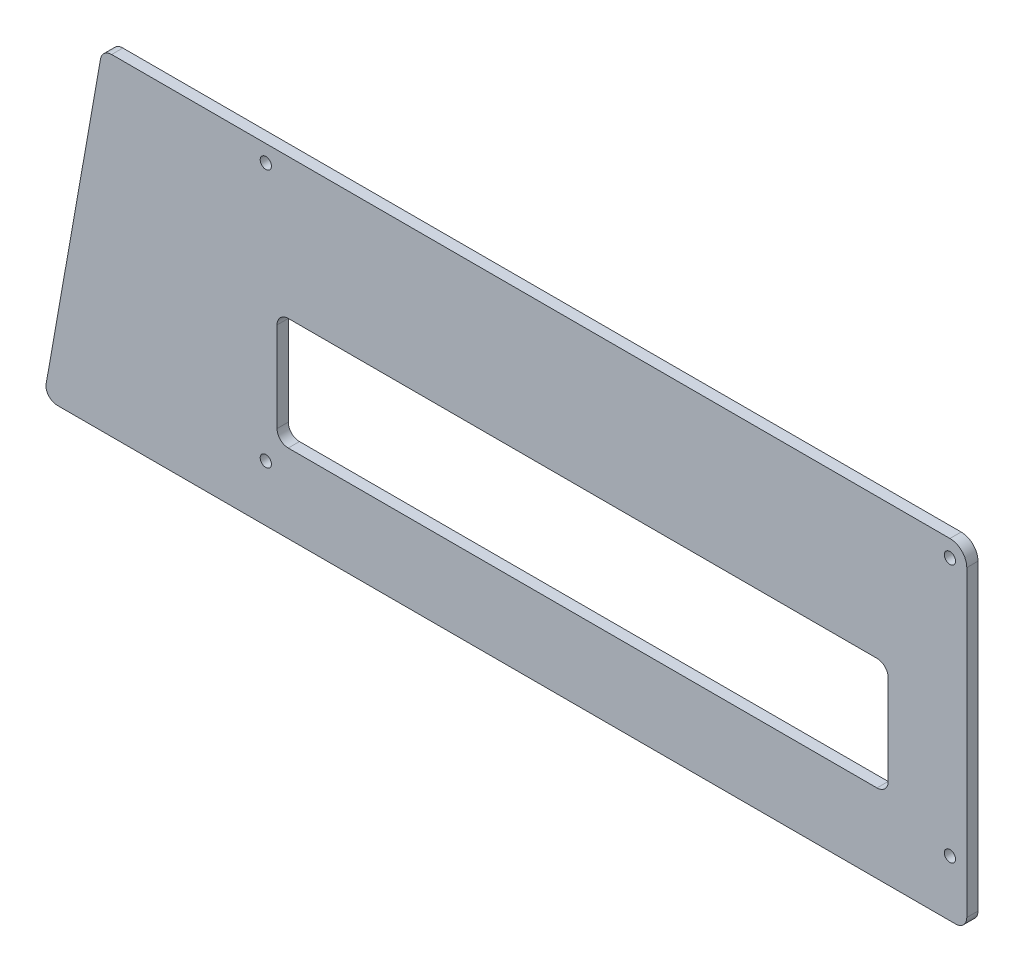
ISO-10303-21;
HEADER;
FILE_DESCRIPTION(('STEP AP214'),'2;1');
FILE_NAME('part.step','',(''),(''),'','','');
FILE_SCHEMA(('AUTOMOTIVE_DESIGN { 1 0 10303 214 1 1 1 1 }'));
ENDSEC;
DATA;
#1=APPLICATION_CONTEXT('core data for automotive mechanical design processes');
#2=APPLICATION_PROTOCOL_DEFINITION('international standard','automotive_design',2000,#1);
#3=PRODUCT_CONTEXT('',#1,'mechanical');
#4=PRODUCT('Part','Part','',(#3));
#5=PRODUCT_RELATED_PRODUCT_CATEGORY('part','',(#4));
#6=PRODUCT_DEFINITION_FORMATION('','',#4);
#7=PRODUCT_DEFINITION_CONTEXT('part definition',#1,'design');
#8=PRODUCT_DEFINITION('design','',#6,#7);
#9=PRODUCT_DEFINITION_SHAPE('','',#8);
#10=(LENGTH_UNIT() NAMED_UNIT(*) SI_UNIT(.MILLI.,.METRE.));
#11=(NAMED_UNIT(*) PLANE_ANGLE_UNIT() SI_UNIT($,.RADIAN.));
#12=(NAMED_UNIT(*) SI_UNIT($,.STERADIAN.) SOLID_ANGLE_UNIT());
#13=UNCERTAINTY_MEASURE_WITH_UNIT(LENGTH_MEASURE(1.E-05),#10,'distance_accuracy_value','');
#14=(GEOMETRIC_REPRESENTATION_CONTEXT(3) GLOBAL_UNCERTAINTY_ASSIGNED_CONTEXT((#13)) GLOBAL_UNIT_ASSIGNED_CONTEXT((#10,
#11,#12)) REPRESENTATION_CONTEXT('',''));
#15=CARTESIAN_POINT('',(0.,0.,0.));
#16=DIRECTION('',(0.,0.,1.));
#17=DIRECTION('',(1.,0.,0.));
#18=AXIS2_PLACEMENT_3D('',#15,#16,#17);
#19=CARTESIAN_POINT('',(58.1647011961699,256.380138422723,10.));
#20=DIRECTION('',(0.,0.,-1.));
#21=DIRECTION('',(-1.,0.,0.));
#22=AXIS2_PLACEMENT_3D('',#19,#20,#21);
#23=PLANE('',#22);
#24=CARTESIAN_POINT('',(58.1647011961699,26.3801384227226,10.));
#25=DIRECTION('',(0.,0.,1.));
#26=DIRECTION('',(-1.,0.,0.));
#27=AXIS2_PLACEMENT_3D('',#24,#25,#26);
#28=CIRCLE('',#27,5.00000000000004);
#29=CARTESIAN_POINT('',(53.1647011961699,26.3801384227226,10.));
#30=VERTEX_POINT('',#29);
#31=EDGE_CURVE('E210',#30,#30,#28,.T.);
#32=ORIENTED_EDGE('',*,*,#31,.F.);
#33=EDGE_LOOP('',(#32));
#34=FACE_BOUND('',#33,.T.);
#35=CARTESIAN_POINT('',(-551.43529880383,256.380138422723,10.));
#36=DIRECTION('',(0.,0.,1.));
#37=DIRECTION('',(1.,0.,0.));
#38=AXIS2_PLACEMENT_3D('',#35,#36,#37);
#39=CIRCLE('',#38,5.00000000000005);
#40=CARTESIAN_POINT('',(-546.43529880383,256.380138422723,10.));
#41=VERTEX_POINT('',#40);
#42=EDGE_CURVE('E222',#41,#41,#39,.T.);
#43=ORIENTED_EDGE('',*,*,#42,.F.);
#44=EDGE_LOOP('',(#43));
#45=FACE_BOUND('',#44,.T.);
#46=CARTESIAN_POINT('',(58.1647011961699,256.380138422723,10.));
#47=DIRECTION('',(0.,0.,1.));
#48=DIRECTION('',(-1.,0.,0.));
#49=AXIS2_PLACEMENT_3D('',#46,#47,#48);
#50=CIRCLE('',#49,15.0000000000001);
#51=CARTESIAN_POINT('',(73.16470119617,256.380138422723,10.));
#52=VERTEX_POINT('',#51);
#53=CARTESIAN_POINT('',(58.1647011961699,271.380138422723,10.));
#54=VERTEX_POINT('',#53);
#55=EDGE_CURVE('E234',#52,#54,#50,.T.);
#56=ORIENTED_EDGE('',*,*,#55,.T.);
#57=DIRECTION('',(-1.,0.,0.));
#58=VECTOR('',#57,1.);
#59=CARTESIAN_POINT('',(58.1647011961699,271.380138422723,10.));
#60=LINE('',#59,#58);
#61=CARTESIAN_POINT('',(-688.827843183062,271.380138422723,10.));
#62=VERTEX_POINT('',#61);
#63=EDGE_CURVE('E237',#54,#62,#60,.T.);
#64=ORIENTED_EDGE('',*,*,#63,.T.);
#65=CARTESIAN_POINT('',(-688.827843183062,261.380138422723,10.));
#66=DIRECTION('',(0.,0.,1.));
#67=DIRECTION('',(1.,0.,0.));
#68=AXIS2_PLACEMENT_3D('',#65,#66,#67);
#69=CIRCLE('',#68,9.99999999999999);
#70=CARTESIAN_POINT('',(-698.675920713184,263.116620199392,10.));
#71=VERTEX_POINT('',#70);
#72=EDGE_CURVE('E240',#62,#71,#69,.T.);
#73=ORIENTED_EDGE('',*,*,#72,.T.);
#74=DIRECTION('',(-0.173648177666925,-0.984807753012209,0.));
#75=VECTOR('',#74,1.);
#76=CARTESIAN_POINT('',(-747.16584040801,-11.8833798006081,10.));
#77=LINE('',#76,#75);
#78=CARTESIAN_POINT('',(-747.16584040801,-11.8833798006081,10.));
#79=VERTEX_POINT('',#78);
#80=EDGE_CURVE('E242',#71,#79,#77,.T.);
#81=ORIENTED_EDGE('',*,*,#80,.T.);
#82=CARTESIAN_POINT('',(-737.317762877888,-13.6198615772775,10.));
#83=DIRECTION('',(0.,0.,1.));
#84=DIRECTION('',(-1.,0.,0.));
#85=AXIS2_PLACEMENT_3D('',#82,#83,#84);
#86=CIRCLE('',#85,10.);
#87=CARTESIAN_POINT('',(-737.317762877888,-23.6198615772775,10.));
#88=VERTEX_POINT('',#87);
#89=EDGE_CURVE('E244',#79,#88,#86,.T.);
#90=ORIENTED_EDGE('',*,*,#89,.T.);
#91=DIRECTION('',(1.,0.,0.));
#92=VECTOR('',#91,1.);
#93=CARTESIAN_POINT('',(-737.317762877888,-23.6198615772775,10.));
#94=LINE('',#93,#92);
#95=CARTESIAN_POINT('',(63.1647011961699,-23.6198615772775,10.));
#96=VERTEX_POINT('',#95);
#97=EDGE_CURVE('E246',#88,#96,#94,.T.);
#98=ORIENTED_EDGE('',*,*,#97,.T.);
#99=CARTESIAN_POINT('',(63.1647011961699,-13.6198615772775,10.));
#100=DIRECTION('',(0.,0.,1.));
#101=DIRECTION('',(1.,0.,0.));
#102=AXIS2_PLACEMENT_3D('',#99,#100,#101);
#103=CIRCLE('',#102,10.);
#104=CARTESIAN_POINT('',(73.1647011961699,-13.6198615772774,10.));
#105=VERTEX_POINT('',#104);
#106=EDGE_CURVE('E248',#96,#105,#103,.T.);
#107=ORIENTED_EDGE('',*,*,#106,.T.);
#108=DIRECTION('',(0.,1.,0.));
#109=VECTOR('',#108,1.);
#110=CARTESIAN_POINT('',(73.16470119617,256.380138422723,10.));
#111=LINE('',#110,#109);
#112=EDGE_CURVE('E250',#105,#52,#111,.T.);
#113=ORIENTED_EDGE('',*,*,#112,.T.);
#114=EDGE_LOOP('',(#56,#64,#73,#81,#90,#98,#107,#113));
#115=FACE_BOUND('',#114,.T.);
#116=CARTESIAN_POINT('',(-551.43529880383,26.3801384227226,10.));
#117=DIRECTION('',(0.,0.,1.));
#118=DIRECTION('',(1.,0.,0.));
#119=AXIS2_PLACEMENT_3D('',#116,#117,#118);
#120=CIRCLE('',#119,5.00000000000004);
#121=CARTESIAN_POINT('',(-546.43529880383,26.3801384227226,10.));
#122=VERTEX_POINT('',#121);
#123=EDGE_CURVE('E228',#122,#122,#120,.T.);
#124=ORIENTED_EDGE('',*,*,#123,.F.);
#125=EDGE_LOOP('',(#124));
#126=FACE_BOUND('',#125,.T.);
#127=CARTESIAN_POINT('',(58.1647011961699,256.380138422723,10.));
#128=DIRECTION('',(0.,0.,1.));
#129=DIRECTION('',(-1.,0.,0.));
#130=AXIS2_PLACEMENT_3D('',#127,#128,#129);
#131=CIRCLE('',#130,5.00000000000005);
#132=CARTESIAN_POINT('',(53.1647011961699,256.380138422723,10.));
#133=VERTEX_POINT('',#132);
#134=EDGE_CURVE('E216',#133,#133,#131,.T.);
#135=ORIENTED_EDGE('',*,*,#134,.F.);
#136=EDGE_LOOP('',(#135));
#137=FACE_BOUND('',#136,.T.);
#138=CARTESIAN_POINT('',(-531.43529880383,56.3801384227226,10.));
#139=DIRECTION('',(0.,0.,1.));
#140=DIRECTION('',(1.,0.,0.));
#141=AXIS2_PLACEMENT_3D('',#138,#139,#140);
#142=CIRCLE('',#141,10.);
#143=CARTESIAN_POINT('',(-541.43529880383,56.3801384227226,10.));
#144=VERTEX_POINT('',#143);
#145=CARTESIAN_POINT('',(-531.43529880383,46.3801384227226,10.));
#146=VERTEX_POINT('',#145);
#147=EDGE_CURVE('E145',#144,#146,#142,.T.);
#148=ORIENTED_EDGE('',*,*,#147,.F.);
#149=DIRECTION('',(0.,-1.,0.));
#150=VECTOR('',#149,1.);
#151=CARTESIAN_POINT('',(-541.43529880383,56.3801384227226,10.));
#152=LINE('',#151,#150);
#153=CARTESIAN_POINT('',(-541.43529880383,136.380138422722,10.));
#154=VERTEX_POINT('',#153);
#155=EDGE_CURVE('E178',#154,#144,#152,.T.);
#156=ORIENTED_EDGE('',*,*,#155,.F.);
#157=CARTESIAN_POINT('',(-531.43529880383,136.380138422723,10.));
#158=DIRECTION('',(0.,0.,1.));
#159=DIRECTION('',(1.,0.,0.));
#160=AXIS2_PLACEMENT_3D('',#157,#158,#159);
#161=CIRCLE('',#160,10.);
#162=CARTESIAN_POINT('',(-531.43529880383,146.380138422723,10.));
#163=VERTEX_POINT('',#162);
#164=EDGE_CURVE('E176',#163,#154,#161,.T.);
#165=ORIENTED_EDGE('',*,*,#164,.F.);
#166=DIRECTION('',(-1.,0.,0.));
#167=VECTOR('',#166,1.);
#168=CARTESIAN_POINT('',(-531.43529880383,146.380138422723,10.));
#169=LINE('',#168,#167);
#170=CARTESIAN_POINT('',(-6.83529880383011,146.380138422723,10.));
#171=VERTEX_POINT('',#170);
#172=EDGE_CURVE('E174',#171,#163,#169,.T.);
#173=ORIENTED_EDGE('',*,*,#172,.F.);
#174=CARTESIAN_POINT('',(-6.83529880383004,136.380138422723,10.));
#175=DIRECTION('',(0.,0.,1.));
#176=DIRECTION('',(1.,0.,0.));
#177=AXIS2_PLACEMENT_3D('',#174,#175,#176);
#178=CIRCLE('',#177,10.);
#179=CARTESIAN_POINT('',(3.16470119616996,136.380138422722,10.));
#180=VERTEX_POINT('',#179);
#181=EDGE_CURVE('E172',#180,#171,#178,.T.);
#182=ORIENTED_EDGE('',*,*,#181,.F.);
#183=DIRECTION('',(0.,1.,0.));
#184=VECTOR('',#183,1.);
#185=CARTESIAN_POINT('',(3.16470119616996,136.380138422722,10.));
#186=LINE('',#185,#184);
#187=CARTESIAN_POINT('',(3.16470119616996,56.3801384227226,10.));
#188=VERTEX_POINT('',#187);
#189=EDGE_CURVE('E168',#188,#180,#186,.T.);
#190=ORIENTED_EDGE('',*,*,#189,.F.);
#191=CARTESIAN_POINT('',(-6.83529880383004,56.3801384227225,10.));
#192=DIRECTION('',(0.,0.,1.));
#193=DIRECTION('',(1.,0.,0.));
#194=AXIS2_PLACEMENT_3D('',#191,#192,#193);
#195=CIRCLE('',#194,10.);
#196=CARTESIAN_POINT('',(-6.83529880383011,46.3801384227225,10.));
#197=VERTEX_POINT('',#196);
#198=EDGE_CURVE('E166',#197,#188,#195,.T.);
#199=ORIENTED_EDGE('',*,*,#198,.F.);
#200=DIRECTION('',(1.,0.,0.));
#201=VECTOR('',#200,1.);
#202=CARTESIAN_POINT('',(-531.43529880383,46.3801384227226,10.));
#203=LINE('',#202,#201);
#204=EDGE_CURVE('E153',#146,#197,#203,.T.);
#205=ORIENTED_EDGE('',*,*,#204,.F.);
#206=EDGE_LOOP('',(#148,#156,#165,#173,#182,#190,#199,#205));
#207=FACE_BOUND('',#206,.T.);
#208=ADVANCED_FACE('F32',(#34,#45,#115,#126,#137,#207),#23,.F.);
#209=CARTESIAN_POINT('',(58.1647011961699,256.380138422723,0.));
#210=DIRECTION('',(0.,0.,-1.));
#211=DIRECTION('',(-1.,0.,0.));
#212=AXIS2_PLACEMENT_3D('',#209,#210,#211);
#213=PLANE('',#212);
#214=CARTESIAN_POINT('',(58.1647011961699,26.3801384227226,0.));
#215=DIRECTION('',(0.,0.,1.));
#216=DIRECTION('',(-1.,0.,0.));
#217=AXIS2_PLACEMENT_3D('',#214,#215,#216);
#218=CIRCLE('',#217,5.00000000000004);
#219=CARTESIAN_POINT('',(53.1647011961699,26.3801384227226,0.));
#220=VERTEX_POINT('',#219);
#221=EDGE_CURVE('E161',#220,#220,#218,.T.);
#222=ORIENTED_EDGE('',*,*,#221,.T.);
#223=EDGE_LOOP('',(#222));
#224=FACE_BOUND('',#223,.T.);
#225=CARTESIAN_POINT('',(-551.43529880383,256.380138422723,0.));
#226=DIRECTION('',(0.,0.,1.));
#227=DIRECTION('',(1.,0.,0.));
#228=AXIS2_PLACEMENT_3D('',#225,#226,#227);
#229=CIRCLE('',#228,5.00000000000005);
#230=CARTESIAN_POINT('',(-546.43529880383,256.380138422723,0.));
#231=VERTEX_POINT('',#230);
#232=EDGE_CURVE('E219',#231,#231,#229,.T.);
#233=ORIENTED_EDGE('',*,*,#232,.T.);
#234=EDGE_LOOP('',(#233));
#235=FACE_BOUND('',#234,.T.);
#236=CARTESIAN_POINT('',(58.1647011961699,256.380138422723,0.));
#237=DIRECTION('',(0.,0.,1.));
#238=DIRECTION('',(-1.,0.,0.));
#239=AXIS2_PLACEMENT_3D('',#236,#237,#238);
#240=CIRCLE('',#239,15.0000000000001);
#241=CARTESIAN_POINT('',(73.16470119617,256.380138422723,0.));
#242=VERTEX_POINT('',#241);
#243=CARTESIAN_POINT('',(58.1647011961699,271.380138422723,0.));
#244=VERTEX_POINT('',#243);
#245=EDGE_CURVE('E231',#242,#244,#240,.T.);
#246=ORIENTED_EDGE('',*,*,#245,.F.);
#247=DIRECTION('',(0.,1.,0.));
#248=VECTOR('',#247,1.);
#249=CARTESIAN_POINT('',(73.16470119617,256.380138422723,0.));
#250=LINE('',#249,#248);
#251=CARTESIAN_POINT('',(73.1647011961699,-13.6198615772774,0.));
#252=VERTEX_POINT('',#251);
#253=EDGE_CURVE('E238',#252,#242,#250,.T.);
#254=ORIENTED_EDGE('',*,*,#253,.F.);
#255=CARTESIAN_POINT('',(63.1647011961699,-13.6198615772775,0.));
#256=DIRECTION('',(0.,0.,1.));
#257=DIRECTION('',(1.,0.,0.));
#258=AXIS2_PLACEMENT_3D('',#255,#256,#257);
#259=CIRCLE('',#258,10.);
#260=CARTESIAN_POINT('',(63.1647011961699,-23.6198615772775,0.));
#261=VERTEX_POINT('',#260);
#262=EDGE_CURVE('E265',#261,#252,#259,.T.);
#263=ORIENTED_EDGE('',*,*,#262,.F.);
#264=DIRECTION('',(1.,0.,0.));
#265=VECTOR('',#264,1.);
#266=CARTESIAN_POINT('',(-737.317762877888,-23.6198615772775,0.));
#267=LINE('',#266,#265);
#268=CARTESIAN_POINT('',(-737.317762877888,-23.6198615772775,0.));
#269=VERTEX_POINT('',#268);
#270=EDGE_CURVE('E263',#269,#261,#267,.T.);
#271=ORIENTED_EDGE('',*,*,#270,.F.);
#272=CARTESIAN_POINT('',(-737.317762877888,-13.6198615772775,0.));
#273=DIRECTION('',(0.,0.,1.));
#274=DIRECTION('',(-1.,0.,0.));
#275=AXIS2_PLACEMENT_3D('',#272,#273,#274);
#276=CIRCLE('',#275,10.);
#277=CARTESIAN_POINT('',(-747.16584040801,-11.8833798006081,0.));
#278=VERTEX_POINT('',#277);
#279=EDGE_CURVE('E261',#278,#269,#276,.T.);
#280=ORIENTED_EDGE('',*,*,#279,.F.);
#281=DIRECTION('',(-0.173648177666925,-0.984807753012209,0.));
#282=VECTOR('',#281,1.);
#283=CARTESIAN_POINT('',(-747.16584040801,-11.8833798006081,0.));
#284=LINE('',#283,#282);
#285=CARTESIAN_POINT('',(-698.675920713184,263.116620199392,0.));
#286=VERTEX_POINT('',#285);
#287=EDGE_CURVE('E259',#286,#278,#284,.T.);
#288=ORIENTED_EDGE('',*,*,#287,.F.);
#289=CARTESIAN_POINT('',(-688.827843183062,261.380138422723,0.));
#290=DIRECTION('',(0.,0.,1.));
#291=DIRECTION('',(1.,0.,0.));
#292=AXIS2_PLACEMENT_3D('',#289,#290,#291);
#293=CIRCLE('',#292,9.99999999999999);
#294=CARTESIAN_POINT('',(-688.827843183062,271.380138422723,0.));
#295=VERTEX_POINT('',#294);
#296=EDGE_CURVE('E257',#295,#286,#293,.T.);
#297=ORIENTED_EDGE('',*,*,#296,.F.);
#298=DIRECTION('',(-1.,0.,0.));
#299=VECTOR('',#298,1.);
#300=CARTESIAN_POINT('',(58.1647011961699,271.380138422723,0.));
#301=LINE('',#300,#299);
#302=EDGE_CURVE('E255',#244,#295,#301,.T.);
#303=ORIENTED_EDGE('',*,*,#302,.F.);
#304=EDGE_LOOP('',(#246,#254,#263,#271,#280,#288,#297,#303));
#305=FACE_BOUND('',#304,.T.);
#306=CARTESIAN_POINT('',(-551.43529880383,26.3801384227226,0.));
#307=DIRECTION('',(0.,0.,1.));
#308=DIRECTION('',(1.,0.,0.));
#309=AXIS2_PLACEMENT_3D('',#306,#307,#308);
#310=CIRCLE('',#309,5.00000000000004);
#311=CARTESIAN_POINT('',(-546.43529880383,26.3801384227226,0.));
#312=VERTEX_POINT('',#311);
#313=EDGE_CURVE('E225',#312,#312,#310,.T.);
#314=ORIENTED_EDGE('',*,*,#313,.T.);
#315=EDGE_LOOP('',(#314));
#316=FACE_BOUND('',#315,.T.);
#317=CARTESIAN_POINT('',(58.1647011961699,256.380138422723,0.));
#318=DIRECTION('',(0.,0.,1.));
#319=DIRECTION('',(-1.,0.,0.));
#320=AXIS2_PLACEMENT_3D('',#317,#318,#319);
#321=CIRCLE('',#320,5.00000000000005);
#322=CARTESIAN_POINT('',(53.1647011961699,256.380138422723,0.));
#323=VERTEX_POINT('',#322);
#324=EDGE_CURVE('E213',#323,#323,#321,.T.);
#325=ORIENTED_EDGE('',*,*,#324,.T.);
#326=EDGE_LOOP('',(#325));
#327=FACE_BOUND('',#326,.T.);
#328=DIRECTION('',(0.,-1.,0.));
#329=VECTOR('',#328,1.);
#330=CARTESIAN_POINT('',(-541.43529880383,56.3801384227226,0.));
#331=LINE('',#330,#329);
#332=CARTESIAN_POINT('',(-541.43529880383,136.380138422722,0.));
#333=VERTEX_POINT('',#332);
#334=CARTESIAN_POINT('',(-541.43529880383,56.3801384227226,0.));
#335=VERTEX_POINT('',#334);
#336=EDGE_CURVE('E154',#333,#335,#331,.T.);
#337=ORIENTED_EDGE('',*,*,#336,.T.);
#338=CARTESIAN_POINT('',(-531.43529880383,56.3801384227226,0.));
#339=DIRECTION('',(0.,0.,1.));
#340=DIRECTION('',(1.,0.,0.));
#341=AXIS2_PLACEMENT_3D('',#338,#339,#340);
#342=CIRCLE('',#341,10.);
#343=CARTESIAN_POINT('',(-531.43529880383,46.3801384227226,0.));
#344=VERTEX_POINT('',#343);
#345=EDGE_CURVE('E55',#335,#344,#342,.T.);
#346=ORIENTED_EDGE('',*,*,#345,.T.);
#347=DIRECTION('',(1.,0.,0.));
#348=VECTOR('',#347,1.);
#349=CARTESIAN_POINT('',(-531.43529880383,46.3801384227226,0.));
#350=LINE('',#349,#348);
#351=CARTESIAN_POINT('',(-6.83529880383011,46.3801384227225,0.));
#352=VERTEX_POINT('',#351);
#353=EDGE_CURVE('E160',#344,#352,#350,.T.);
#354=ORIENTED_EDGE('',*,*,#353,.T.);
#355=CARTESIAN_POINT('',(-6.83529880383004,56.3801384227225,0.));
#356=DIRECTION('',(0.,0.,1.));
#357=DIRECTION('',(1.,0.,0.));
#358=AXIS2_PLACEMENT_3D('',#355,#356,#357);
#359=CIRCLE('',#358,10.);
#360=CARTESIAN_POINT('',(3.16470119616996,56.3801384227226,0.));
#361=VERTEX_POINT('',#360);
#362=EDGE_CURVE('E182',#352,#361,#359,.T.);
#363=ORIENTED_EDGE('',*,*,#362,.T.);
#364=DIRECTION('',(0.,1.,0.));
#365=VECTOR('',#364,1.);
#366=CARTESIAN_POINT('',(3.16470119616996,136.380138422722,0.));
#367=LINE('',#366,#365);
#368=CARTESIAN_POINT('',(3.16470119616996,136.380138422722,0.));
#369=VERTEX_POINT('',#368);
#370=EDGE_CURVE('E185',#361,#369,#367,.T.);
#371=ORIENTED_EDGE('',*,*,#370,.T.);
#372=CARTESIAN_POINT('',(-6.83529880383004,136.380138422723,0.));
#373=DIRECTION('',(0.,0.,1.));
#374=DIRECTION('',(1.,0.,0.));
#375=AXIS2_PLACEMENT_3D('',#372,#373,#374);
#376=CIRCLE('',#375,10.);
#377=CARTESIAN_POINT('',(-6.83529880383011,146.380138422723,0.));
#378=VERTEX_POINT('',#377);
#379=EDGE_CURVE('E188',#369,#378,#376,.T.);
#380=ORIENTED_EDGE('',*,*,#379,.T.);
#381=DIRECTION('',(-1.,0.,0.));
#382=VECTOR('',#381,1.);
#383=CARTESIAN_POINT('',(-531.43529880383,146.380138422723,0.));
#384=LINE('',#383,#382);
#385=CARTESIAN_POINT('',(-531.43529880383,146.380138422723,0.));
#386=VERTEX_POINT('',#385);
#387=EDGE_CURVE('E191',#378,#386,#384,.T.);
#388=ORIENTED_EDGE('',*,*,#387,.T.);
#389=CARTESIAN_POINT('',(-531.43529880383,136.380138422723,0.));
#390=DIRECTION('',(0.,0.,1.));
#391=DIRECTION('',(1.,0.,0.));
#392=AXIS2_PLACEMENT_3D('',#389,#390,#391);
#393=CIRCLE('',#392,10.);
#394=EDGE_CURVE('E194',#386,#333,#393,.T.);
#395=ORIENTED_EDGE('',*,*,#394,.T.);
#396=EDGE_LOOP('',(#337,#346,#354,#363,#371,#380,#388,#395));
#397=FACE_BOUND('',#396,.T.);
#398=ADVANCED_FACE('F295',(#224,#235,#305,#316,#327,#397),#213,.T.);
#399=CARTESIAN_POINT('',(58.1647011961699,256.380138422723,10.));
#400=DIRECTION('',(0.,0.,-1.));
#401=DIRECTION('',(-1.,0.,0.));
#402=AXIS2_PLACEMENT_3D('',#399,#400,#401);
#403=CYLINDRICAL_SURFACE('',#402,15.0000000000001);
#404=ORIENTED_EDGE('',*,*,#245,.T.);
#405=DIRECTION('',(0.,0.,-1.));
#406=VECTOR('',#405,1.);
#407=CARTESIAN_POINT('',(58.1647011961699,271.380138422723,10.));
#408=LINE('',#407,#406);
#409=EDGE_CURVE('E11',#54,#244,#408,.T.);
#410=ORIENTED_EDGE('',*,*,#409,.F.);
#411=ORIENTED_EDGE('',*,*,#55,.F.);
#412=DIRECTION('',(0.,0.,-1.));
#413=VECTOR('',#412,1.);
#414=CARTESIAN_POINT('',(73.16470119617,256.380138422723,10.));
#415=LINE('',#414,#413);
#416=EDGE_CURVE('E252',#52,#242,#415,.T.);
#417=ORIENTED_EDGE('',*,*,#416,.T.);
#418=EDGE_LOOP('',(#404,#410,#411,#417));
#419=FACE_BOUND('',#418,.T.);
#420=ADVANCED_FACE('F34',(#419),#403,.T.);
#421=CARTESIAN_POINT('',(58.1647011961699,271.380138422723,10.));
#422=DIRECTION('',(0.,-1.,0.));
#423=DIRECTION('',(1.,0.,0.));
#424=AXIS2_PLACEMENT_3D('',#421,#422,#423);
#425=PLANE('',#424);
#426=ORIENTED_EDGE('',*,*,#302,.T.);
#427=DIRECTION('',(0.,0.,-1.));
#428=VECTOR('',#427,1.);
#429=CARTESIAN_POINT('',(-688.827843183062,271.380138422723,10.));
#430=LINE('',#429,#428);
#431=EDGE_CURVE('E40',#62,#295,#430,.T.);
#432=ORIENTED_EDGE('',*,*,#431,.F.);
#433=ORIENTED_EDGE('',*,*,#63,.F.);
#434=ORIENTED_EDGE('',*,*,#409,.T.);
#435=EDGE_LOOP('',(#426,#432,#433,#434));
#436=FACE_BOUND('',#435,.T.);
#437=ADVANCED_FACE('F313',(#436),#425,.F.);
#438=CARTESIAN_POINT('',(-688.827843183062,261.380138422723,10.));
#439=DIRECTION('',(0.,0.,-1.));
#440=DIRECTION('',(-1.,0.,0.));
#441=AXIS2_PLACEMENT_3D('',#438,#439,#440);
#442=CYLINDRICAL_SURFACE('',#441,9.99999999999999);
#443=ORIENTED_EDGE('',*,*,#296,.T.);
#444=DIRECTION('',(0.,0.,-1.));
#445=VECTOR('',#444,1.);
#446=CARTESIAN_POINT('',(-698.675920713184,263.116620199392,10.));
#447=LINE('',#446,#445);
#448=EDGE_CURVE('E282',#71,#286,#447,.T.);
#449=ORIENTED_EDGE('',*,*,#448,.F.);
#450=ORIENTED_EDGE('',*,*,#72,.F.);
#451=ORIENTED_EDGE('',*,*,#431,.T.);
#452=EDGE_LOOP('',(#443,#449,#450,#451));
#453=FACE_BOUND('',#452,.T.);
#454=ADVANCED_FACE('F289',(#453),#442,.T.);
#455=CARTESIAN_POINT('',(-747.16584040801,-11.8833798006081,10.));
#456=DIRECTION('',(0.984807753012209,-0.173648177666925,0.));
#457=DIRECTION('',(0.173648177666925,0.984807753012209,0.));
#458=AXIS2_PLACEMENT_3D('',#455,#456,#457);
#459=PLANE('',#458);
#460=ORIENTED_EDGE('',*,*,#287,.T.);
#461=DIRECTION('',(0.,0.,-1.));
#462=VECTOR('',#461,1.);
#463=CARTESIAN_POINT('',(-747.16584040801,-11.8833798006081,10.));
#464=LINE('',#463,#462);
#465=EDGE_CURVE('E279',#79,#278,#464,.T.);
#466=ORIENTED_EDGE('',*,*,#465,.F.);
#467=ORIENTED_EDGE('',*,*,#80,.F.);
#468=ORIENTED_EDGE('',*,*,#448,.T.);
#469=EDGE_LOOP('',(#460,#466,#467,#468));
#470=FACE_BOUND('',#469,.T.);
#471=ADVANCED_FACE('F301',(#470),#459,.F.);
#472=CARTESIAN_POINT('',(-737.317762877888,-13.6198615772775,10.));
#473=DIRECTION('',(0.,0.,-1.));
#474=DIRECTION('',(-1.,0.,0.));
#475=AXIS2_PLACEMENT_3D('',#472,#473,#474);
#476=CYLINDRICAL_SURFACE('',#475,10.);
#477=ORIENTED_EDGE('',*,*,#279,.T.);
#478=DIRECTION('',(0.,0.,-1.));
#479=VECTOR('',#478,1.);
#480=CARTESIAN_POINT('',(-737.317762877888,-23.6198615772775,10.));
#481=LINE('',#480,#479);
#482=EDGE_CURVE('E276',#88,#269,#481,.T.);
#483=ORIENTED_EDGE('',*,*,#482,.F.);
#484=ORIENTED_EDGE('',*,*,#89,.F.);
#485=ORIENTED_EDGE('',*,*,#465,.T.);
#486=EDGE_LOOP('',(#477,#483,#484,#485));
#487=FACE_BOUND('',#486,.T.);
#488=ADVANCED_FACE('F305',(#487),#476,.T.);
#489=CARTESIAN_POINT('',(-737.317762877888,-23.6198615772775,10.));
#490=DIRECTION('',(0.,1.,0.));
#491=DIRECTION('',(-1.,0.,0.));
#492=AXIS2_PLACEMENT_3D('',#489,#490,#491);
#493=PLANE('',#492);
#494=ORIENTED_EDGE('',*,*,#270,.T.);
#495=DIRECTION('',(0.,0.,-1.));
#496=VECTOR('',#495,1.);
#497=CARTESIAN_POINT('',(63.1647011961699,-23.6198615772775,10.));
#498=LINE('',#497,#496);
#499=EDGE_CURVE('E273',#96,#261,#498,.T.);
#500=ORIENTED_EDGE('',*,*,#499,.F.);
#501=ORIENTED_EDGE('',*,*,#97,.F.);
#502=ORIENTED_EDGE('',*,*,#482,.T.);
#503=EDGE_LOOP('',(#494,#500,#501,#502));
#504=FACE_BOUND('',#503,.T.);
#505=ADVANCED_FACE('F326',(#504),#493,.F.);
#506=CARTESIAN_POINT('',(63.1647011961699,-13.6198615772775,10.));
#507=DIRECTION('',(0.,0.,-1.));
#508=DIRECTION('',(-1.,0.,0.));
#509=AXIS2_PLACEMENT_3D('',#506,#507,#508);
#510=CYLINDRICAL_SURFACE('',#509,10.);
#511=ORIENTED_EDGE('',*,*,#262,.T.);
#512=DIRECTION('',(0.,0.,-1.));
#513=VECTOR('',#512,1.);
#514=CARTESIAN_POINT('',(73.1647011961699,-13.6198615772774,10.));
#515=LINE('',#514,#513);
#516=EDGE_CURVE('E270',#105,#252,#515,.T.);
#517=ORIENTED_EDGE('',*,*,#516,.F.);
#518=ORIENTED_EDGE('',*,*,#106,.F.);
#519=ORIENTED_EDGE('',*,*,#499,.T.);
#520=EDGE_LOOP('',(#511,#517,#518,#519));
#521=FACE_BOUND('',#520,.T.);
#522=ADVANCED_FACE('F324',(#521),#510,.T.);
#523=CARTESIAN_POINT('',(73.16470119617,256.380138422723,10.));
#524=DIRECTION('',(-1.,0.,0.));
#525=DIRECTION('',(0.,-1.,0.));
#526=AXIS2_PLACEMENT_3D('',#523,#524,#525);
#527=PLANE('',#526);
#528=ORIENTED_EDGE('',*,*,#253,.T.);
#529=ORIENTED_EDGE('',*,*,#416,.F.);
#530=ORIENTED_EDGE('',*,*,#112,.F.);
#531=ORIENTED_EDGE('',*,*,#516,.T.);
#532=EDGE_LOOP('',(#528,#529,#530,#531));
#533=FACE_BOUND('',#532,.T.);
#534=ADVANCED_FACE('F319',(#533),#527,.F.);
#535=CARTESIAN_POINT('',(-551.43529880383,26.3801384227226,10.));
#536=DIRECTION('',(0.,0.,-1.));
#537=DIRECTION('',(-1.,0.,0.));
#538=AXIS2_PLACEMENT_3D('',#535,#536,#537);
#539=CYLINDRICAL_SURFACE('',#538,5.00000000000004);
#540=ORIENTED_EDGE('',*,*,#123,.T.);
#541=EDGE_LOOP('',(#540));
#542=FACE_BOUND('',#541,.T.);
#543=ORIENTED_EDGE('',*,*,#313,.F.);
#544=EDGE_LOOP('',(#543));
#545=FACE_BOUND('',#544,.T.);
#546=ADVANCED_FACE('F346',(#542,#545),#539,.F.);
#547=CARTESIAN_POINT('',(-551.43529880383,256.380138422723,10.));
#548=DIRECTION('',(0.,0.,-1.));
#549=DIRECTION('',(-1.,0.,0.));
#550=AXIS2_PLACEMENT_3D('',#547,#548,#549);
#551=CYLINDRICAL_SURFACE('',#550,5.00000000000005);
#552=ORIENTED_EDGE('',*,*,#42,.T.);
#553=EDGE_LOOP('',(#552));
#554=FACE_BOUND('',#553,.T.);
#555=ORIENTED_EDGE('',*,*,#232,.F.);
#556=EDGE_LOOP('',(#555));
#557=FACE_BOUND('',#556,.T.);
#558=ADVANCED_FACE('F353',(#554,#557),#551,.F.);
#559=CARTESIAN_POINT('',(58.1647011961699,256.380138422723,10.));
#560=DIRECTION('',(0.,0.,-1.));
#561=DIRECTION('',(-1.,0.,0.));
#562=AXIS2_PLACEMENT_3D('',#559,#560,#561);
#563=CYLINDRICAL_SURFACE('',#562,5.00000000000005);
#564=ORIENTED_EDGE('',*,*,#134,.T.);
#565=EDGE_LOOP('',(#564));
#566=FACE_BOUND('',#565,.T.);
#567=ORIENTED_EDGE('',*,*,#324,.F.);
#568=EDGE_LOOP('',(#567));
#569=FACE_BOUND('',#568,.T.);
#570=ADVANCED_FACE('F358',(#566,#569),#563,.F.);
#571=CARTESIAN_POINT('',(58.1647011961699,26.3801384227226,10.));
#572=DIRECTION('',(0.,0.,-1.));
#573=DIRECTION('',(-1.,0.,0.));
#574=AXIS2_PLACEMENT_3D('',#571,#572,#573);
#575=CYLINDRICAL_SURFACE('',#574,5.00000000000004);
#576=ORIENTED_EDGE('',*,*,#31,.T.);
#577=EDGE_LOOP('',(#576));
#578=FACE_BOUND('',#577,.T.);
#579=ORIENTED_EDGE('',*,*,#221,.F.);
#580=EDGE_LOOP('',(#579));
#581=FACE_BOUND('',#580,.T.);
#582=ADVANCED_FACE('F401',(#578,#581),#575,.F.);
#583=CARTESIAN_POINT('',(-531.43529880383,56.3801384227226,10.));
#584=DIRECTION('',(0.,0.,-1.));
#585=DIRECTION('',(-1.,0.,0.));
#586=AXIS2_PLACEMENT_3D('',#583,#584,#585);
#587=CYLINDRICAL_SURFACE('',#586,10.);
#588=ORIENTED_EDGE('',*,*,#345,.F.);
#589=DIRECTION('',(0.,0.,-1.));
#590=VECTOR('',#589,1.);
#591=CARTESIAN_POINT('',(-541.43529880383,56.3801384227226,10.));
#592=LINE('',#591,#590);
#593=EDGE_CURVE('E149',#144,#335,#592,.T.);
#594=ORIENTED_EDGE('',*,*,#593,.F.);
#595=ORIENTED_EDGE('',*,*,#147,.T.);
#596=DIRECTION('',(0.,0.,-1.));
#597=VECTOR('',#596,1.);
#598=CARTESIAN_POINT('',(-531.43529880383,46.3801384227226,10.));
#599=LINE('',#598,#597);
#600=EDGE_CURVE('E148',#146,#344,#599,.T.);
#601=ORIENTED_EDGE('',*,*,#600,.T.);
#602=EDGE_LOOP('',(#588,#594,#595,#601));
#603=FACE_BOUND('',#602,.T.);
#604=ADVANCED_FACE('F147',(#603),#587,.F.);
#605=CARTESIAN_POINT('',(-531.43529880383,46.3801384227226,10.));
#606=DIRECTION('',(0.,1.,0.));
#607=DIRECTION('',(-1.,0.,0.));
#608=AXIS2_PLACEMENT_3D('',#605,#606,#607);
#609=PLANE('',#608);
#610=ORIENTED_EDGE('',*,*,#353,.F.);
#611=ORIENTED_EDGE('',*,*,#600,.F.);
#612=ORIENTED_EDGE('',*,*,#204,.T.);
#613=DIRECTION('',(0.,0.,-1.));
#614=VECTOR('',#613,1.);
#615=CARTESIAN_POINT('',(-6.83529880383011,46.3801384227225,10.));
#616=LINE('',#615,#614);
#617=EDGE_CURVE('E162',#197,#352,#616,.T.);
#618=ORIENTED_EDGE('',*,*,#617,.T.);
#619=EDGE_LOOP('',(#610,#611,#612,#618));
#620=FACE_BOUND('',#619,.T.);
#621=ADVANCED_FACE('F157',(#620),#609,.T.);
#622=CARTESIAN_POINT('',(-6.83529880383004,56.3801384227225,10.));
#623=DIRECTION('',(0.,0.,-1.));
#624=DIRECTION('',(-1.,0.,0.));
#625=AXIS2_PLACEMENT_3D('',#622,#623,#624);
#626=CYLINDRICAL_SURFACE('',#625,10.);
#627=ORIENTED_EDGE('',*,*,#362,.F.);
#628=ORIENTED_EDGE('',*,*,#617,.F.);
#629=ORIENTED_EDGE('',*,*,#198,.T.);
#630=DIRECTION('',(0.,0.,-1.));
#631=VECTOR('',#630,1.);
#632=CARTESIAN_POINT('',(3.16470119616996,56.3801384227226,10.));
#633=LINE('',#632,#631);
#634=EDGE_CURVE('E207',#188,#361,#633,.T.);
#635=ORIENTED_EDGE('',*,*,#634,.T.);
#636=EDGE_LOOP('',(#627,#628,#629,#635));
#637=FACE_BOUND('',#636,.T.);
#638=ADVANCED_FACE('F388',(#637),#626,.F.);
#639=CARTESIAN_POINT('',(3.16470119616996,136.380138422722,10.));
#640=DIRECTION('',(-1.,0.,0.));
#641=DIRECTION('',(0.,0.,1.));
#642=AXIS2_PLACEMENT_3D('',#639,#640,#641);
#643=PLANE('',#642);
#644=ORIENTED_EDGE('',*,*,#370,.F.);
#645=ORIENTED_EDGE('',*,*,#634,.F.);
#646=ORIENTED_EDGE('',*,*,#189,.T.);
#647=DIRECTION('',(0.,0.,-1.));
#648=VECTOR('',#647,1.);
#649=CARTESIAN_POINT('',(3.16470119616996,136.380138422722,10.));
#650=LINE('',#649,#648);
#651=EDGE_CURVE('E205',#180,#369,#650,.T.);
#652=ORIENTED_EDGE('',*,*,#651,.T.);
#653=EDGE_LOOP('',(#644,#645,#646,#652));
#654=FACE_BOUND('',#653,.T.);
#655=ADVANCED_FACE('F385',(#654),#643,.T.);
#656=CARTESIAN_POINT('',(-6.83529880383004,136.380138422723,10.));
#657=DIRECTION('',(0.,0.,-1.));
#658=DIRECTION('',(-1.,0.,0.));
#659=AXIS2_PLACEMENT_3D('',#656,#657,#658);
#660=CYLINDRICAL_SURFACE('',#659,10.);
#661=ORIENTED_EDGE('',*,*,#379,.F.);
#662=ORIENTED_EDGE('',*,*,#651,.F.);
#663=ORIENTED_EDGE('',*,*,#181,.T.);
#664=DIRECTION('',(0.,0.,-1.));
#665=VECTOR('',#664,1.);
#666=CARTESIAN_POINT('',(-6.83529880383011,146.380138422723,10.));
#667=LINE('',#666,#665);
#668=EDGE_CURVE('E203',#171,#378,#667,.T.);
#669=ORIENTED_EDGE('',*,*,#668,.T.);
#670=EDGE_LOOP('',(#661,#662,#663,#669));
#671=FACE_BOUND('',#670,.T.);
#672=ADVANCED_FACE('F380',(#671),#660,.F.);
#673=CARTESIAN_POINT('',(-531.43529880383,146.380138422723,10.));
#674=DIRECTION('',(0.,-1.,0.));
#675=DIRECTION('',(0.,0.,-1.));
#676=AXIS2_PLACEMENT_3D('',#673,#674,#675);
#677=PLANE('',#676);
#678=ORIENTED_EDGE('',*,*,#387,.F.);
#679=ORIENTED_EDGE('',*,*,#668,.F.);
#680=ORIENTED_EDGE('',*,*,#172,.T.);
#681=DIRECTION('',(0.,0.,-1.));
#682=VECTOR('',#681,1.);
#683=CARTESIAN_POINT('',(-531.43529880383,146.380138422723,10.));
#684=LINE('',#683,#682);
#685=EDGE_CURVE('E201',#163,#386,#684,.T.);
#686=ORIENTED_EDGE('',*,*,#685,.T.);
#687=EDGE_LOOP('',(#678,#679,#680,#686));
#688=FACE_BOUND('',#687,.T.);
#689=ADVANCED_FACE('F376',(#688),#677,.T.);
#690=CARTESIAN_POINT('',(-531.43529880383,136.380138422723,10.));
#691=DIRECTION('',(0.,0.,-1.));
#692=DIRECTION('',(-1.,0.,0.));
#693=AXIS2_PLACEMENT_3D('',#690,#691,#692);
#694=CYLINDRICAL_SURFACE('',#693,10.);
#695=ORIENTED_EDGE('',*,*,#394,.F.);
#696=ORIENTED_EDGE('',*,*,#685,.F.);
#697=ORIENTED_EDGE('',*,*,#164,.T.);
#698=DIRECTION('',(0.,0.,-1.));
#699=VECTOR('',#698,1.);
#700=CARTESIAN_POINT('',(-541.43529880383,136.380138422722,10.));
#701=LINE('',#700,#699);
#702=EDGE_CURVE('E47',#154,#333,#701,.T.);
#703=ORIENTED_EDGE('',*,*,#702,.T.);
#704=EDGE_LOOP('',(#695,#696,#697,#703));
#705=FACE_BOUND('',#704,.T.);
#706=ADVANCED_FACE('F373',(#705),#694,.F.);
#707=CARTESIAN_POINT('',(-541.43529880383,56.3801384227226,10.));
#708=DIRECTION('',(1.,0.,0.));
#709=DIRECTION('',(0.,1.,0.));
#710=AXIS2_PLACEMENT_3D('',#707,#708,#709);
#711=PLANE('',#710);
#712=ORIENTED_EDGE('',*,*,#336,.F.);
#713=ORIENTED_EDGE('',*,*,#702,.F.);
#714=ORIENTED_EDGE('',*,*,#155,.T.);
#715=ORIENTED_EDGE('',*,*,#593,.T.);
#716=EDGE_LOOP('',(#712,#713,#714,#715));
#717=FACE_BOUND('',#716,.T.);
#718=ADVANCED_FACE('F367',(#717),#711,.T.);
#719=CLOSED_SHELL('',(#208,#398,#420,#437,#454,#471,#488,#505,#522,#534,#546,#558,#570,#582,
#604,#621,#638,#655,#672,#689,#706,#718));
#720=MANIFOLD_SOLID_BREP('B2',#719);
#721=ADVANCED_BREP_SHAPE_REPRESENTATION('',(#18,#720),#14);
#722=SHAPE_DEFINITION_REPRESENTATION(#9,#721);
ENDSEC;
END-ISO-10303-21;
